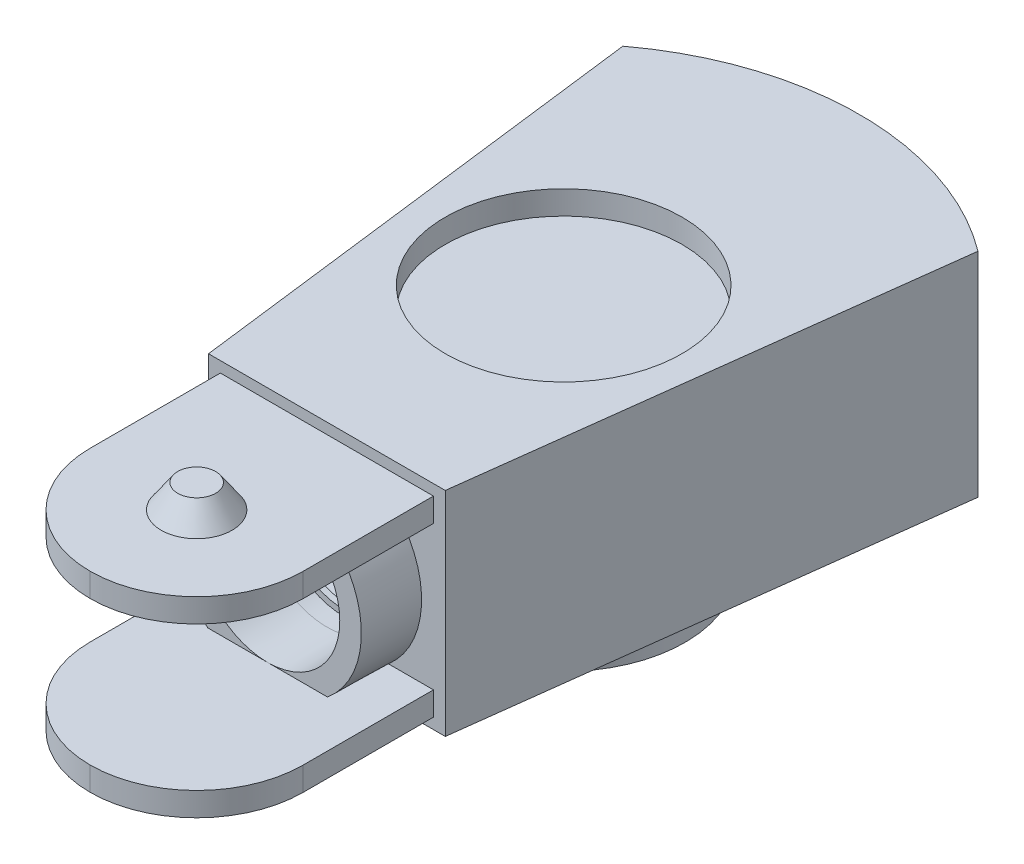
ISO-10303-21;
HEADER;
FILE_DESCRIPTION(('STEP AP214'),'2;1');
FILE_NAME('part.step','',(''),(''),'','','');
FILE_SCHEMA(('AUTOMOTIVE_DESIGN { 1 0 10303 214 1 1 1 1 }'));
ENDSEC;
DATA;
#1=APPLICATION_CONTEXT('core data for automotive mechanical design processes');
#2=APPLICATION_PROTOCOL_DEFINITION('international standard','automotive_design',2000,#1);
#3=PRODUCT_CONTEXT('',#1,'mechanical');
#4=PRODUCT('Part','Part','',(#3));
#5=PRODUCT_RELATED_PRODUCT_CATEGORY('part','',(#4));
#6=PRODUCT_DEFINITION_FORMATION('','',#4);
#7=PRODUCT_DEFINITION_CONTEXT('part definition',#1,'design');
#8=PRODUCT_DEFINITION('design','',#6,#7);
#9=PRODUCT_DEFINITION_SHAPE('','',#8);
#10=(LENGTH_UNIT() NAMED_UNIT(*) SI_UNIT(.MILLI.,.METRE.));
#11=(NAMED_UNIT(*) PLANE_ANGLE_UNIT() SI_UNIT($,.RADIAN.));
#12=(NAMED_UNIT(*) SI_UNIT($,.STERADIAN.) SOLID_ANGLE_UNIT());
#13=UNCERTAINTY_MEASURE_WITH_UNIT(LENGTH_MEASURE(1.E-05),#10,'distance_accuracy_value','');
#14=(GEOMETRIC_REPRESENTATION_CONTEXT(3) GLOBAL_UNCERTAINTY_ASSIGNED_CONTEXT((#13)) GLOBAL_UNIT_ASSIGNED_CONTEXT((#10,
#11,#12)) REPRESENTATION_CONTEXT('',''));
#15=CARTESIAN_POINT('',(0.,0.,0.));
#16=DIRECTION('',(0.,0.,1.));
#17=DIRECTION('',(1.,0.,0.));
#18=AXIS2_PLACEMENT_3D('',#15,#16,#17);
#19=CARTESIAN_POINT('',(0.,9.,5.));
#20=DIRECTION('',(0.,0.,1.));
#21=DIRECTION('',(1.,0.,0.));
#22=AXIS2_PLACEMENT_3D('',#19,#20,#21);
#23=PLANE('',#22);
#24=DIRECTION('',(1.,0.,0.));
#25=VECTOR('',#24,1.);
#26=CARTESIAN_POINT('',(0.,15.0872753246411,5.));
#27=LINE('',#26,#25);
#28=CARTESIAN_POINT('',(-5.05532302727032,15.0872753246411,5.));
#29=VERTEX_POINT('',#28);
#30=CARTESIAN_POINT('',(0.,15.0872753246411,5.00000000000017));
#31=VERTEX_POINT('',#30);
#32=EDGE_CURVE('E358',#29,#31,#27,.T.);
#33=ORIENTED_EDGE('',*,*,#32,.F.);
#34=CARTESIAN_POINT('',(0.,9.,5.));
#35=DIRECTION('',(0.,0.,1.));
#36=DIRECTION('',(1.,0.,0.));
#37=AXIS2_PLACEMENT_3D('',#34,#35,#36);
#38=CIRCLE('',#37,7.91272467535891);
#39=CARTESIAN_POINT('',(-5.05532302727032,2.91272467535891,5.));
#40=VERTEX_POINT('',#39);
#41=EDGE_CURVE('E425',#29,#40,#38,.T.);
#42=ORIENTED_EDGE('',*,*,#41,.T.);
#43=DIRECTION('',(1.,0.,0.));
#44=VECTOR('',#43,1.);
#45=CARTESIAN_POINT('',(0.,2.91272467535891,5.));
#46=LINE('',#45,#44);
#47=CARTESIAN_POINT('',(0.,2.91272467535891,5.));
#48=VERTEX_POINT('',#47);
#49=EDGE_CURVE('E411',#40,#48,#46,.T.);
#50=ORIENTED_EDGE('',*,*,#49,.T.);
#51=CARTESIAN_POINT('',(0.,9.,5.));
#52=DIRECTION('',(0.,0.,1.));
#53=DIRECTION('',(1.,0.,0.));
#54=AXIS2_PLACEMENT_3D('',#51,#52,#53);
#55=CIRCLE('',#54,6.08727532464109);
#56=EDGE_CURVE('E420',#31,#48,#55,.T.);
#57=ORIENTED_EDGE('',*,*,#56,.F.);
#58=EDGE_LOOP('',(#33,#42,#50,#57));
#59=FACE_BOUND('',#58,.T.);
#60=ADVANCED_FACE('F44',(#59),#23,.T.);
#61=CARTESIAN_POINT('',(0.,9.,0.));
#62=DIRECTION('',(0.,0.,-1.));
#63=DIRECTION('',(1.,0.,0.));
#64=AXIS2_PLACEMENT_3D('',#61,#62,#63);
#65=CONICAL_SURFACE('',#64,8.,0.0174532925199433);
#66=ORIENTED_EDGE('',*,*,#41,.F.);
#67=CARTESIAN_POINT('',(-4.583810951182,15.0872753246411,21.7632546142402));
#68=CARTESIAN_POINT('',(-4.65621379185187,15.0872753246411,19.2678319942216));
#69=CARTESIAN_POINT('',(-4.72753868695051,15.0872753246411,16.7723783215212));
#70=CARTESIAN_POINT('',(-4.86827599366824,15.0872753246411,11.7814183800007));
#71=CARTESIAN_POINT('',(-4.93768840633187,15.0872753246411,9.2859121112101));
#72=CARTESIAN_POINT('',(-5.11414042336523,15.0872753246411,2.86487754450447));
#73=CARTESIAN_POINT('',(-5.21994966222969,15.0872753246411,-1.06068452606988));
#74=CARTESIAN_POINT('',(-5.42809839616887,15.0872753246411,-8.91190413269735));
#75=CARTESIAN_POINT('',(-5.53043788825848,15.0872753246411,-12.8375616688297));
#76=CARTESIAN_POINT('',(-5.6313724090243,15.0872753246411,-16.7632546142402));
#77=B_SPLINE_CURVE_WITH_KNOTS('',3,(#67,#68,#69,#70,#71,#72,#73,#74,#75,#76),.UNSPECIFIED.,.F.,
.F.,(4,2,2,2,4),(0.,7.48941770630766,14.9788313220505,26.7597929795082,38.5407647721203),.UNSPECIFIED.);
#78=CARTESIAN_POINT('',(-5.19086496857852,15.0872753246411,0.));
#79=VERTEX_POINT('',#78);
#80=EDGE_CURVE('E351',#29,#79,#77,.T.);
#81=ORIENTED_EDGE('',*,*,#80,.T.);
#82=CARTESIAN_POINT('',(0.,9.,0.));
#83=DIRECTION('',(0.,0.,-1.));
#84=DIRECTION('',(-1.,0.,0.));
#85=AXIS2_PLACEMENT_3D('',#82,#83,#84);
#86=CIRCLE('',#85,8.);
#87=CARTESIAN_POINT('',(-5.19086496857853,2.91272467535891,0.));
#88=VERTEX_POINT('',#87);
#89=EDGE_CURVE('E250',#79,#88,#86,.F.);
#90=ORIENTED_EDGE('',*,*,#89,.T.);
#91=CARTESIAN_POINT('',(-4.58381095118201,2.91272467535891,21.7632546142402));
#92=CARTESIAN_POINT('',(-4.65621379185188,2.91272467535891,19.2678319942216));
#93=CARTESIAN_POINT('',(-4.72753868695051,2.91272467535891,16.7723783215212));
#94=CARTESIAN_POINT('',(-4.86827599366824,2.91272467535891,11.7814183800007));
#95=CARTESIAN_POINT('',(-4.93768840633187,2.91272467535891,9.2859121112101));
#96=CARTESIAN_POINT('',(-5.11414042336524,2.91272467535891,2.86487754450447));
#97=CARTESIAN_POINT('',(-5.2199496622297,2.91272467535891,-1.06068452606988));
#98=CARTESIAN_POINT('',(-5.42809839616887,2.91272467535891,-8.91190413269735));
#99=CARTESIAN_POINT('',(-5.53043788825848,2.91272467535891,-12.8375616688297));
#100=CARTESIAN_POINT('',(-5.63137240902431,2.91272467535891,-16.7632546142402));
#101=B_SPLINE_CURVE_WITH_KNOTS('',3,(#91,#92,#93,#94,#95,#96,#97,#98,#99,#100),.UNSPECIFIED.,
.F.,.F.,(4,2,2,2,4),(0.,7.48941770630766,14.9788313220505,26.7597929795082,38.5407647721203),.UNSPECIFIED.);
#102=EDGE_CURVE('E403',#40,#88,#101,.T.);
#103=ORIENTED_EDGE('',*,*,#102,.F.);
#104=EDGE_LOOP('',(#66,#81,#90,#103));
#105=FACE_BOUND('',#104,.T.);
#106=ADVANCED_FACE('F497',(#105),#65,.T.);
#107=CARTESIAN_POINT('',(-10.,2.,0.));
#108=DIRECTION('',(0.,0.,-1.));
#109=DIRECTION('',(-1.,0.,0.));
#110=AXIS2_PLACEMENT_3D('',#107,#108,#109);
#111=PLANE('',#110);
#112=DIRECTION('',(1.,0.,0.));
#113=VECTOR('',#112,1.);
#114=CARTESIAN_POINT('',(-10.,0.,0.));
#115=LINE('',#114,#113);
#116=CARTESIAN_POINT('',(-10.,0.,0.));
#117=VERTEX_POINT('',#116);
#118=CARTESIAN_POINT('',(10.,0.,0.));
#119=VERTEX_POINT('',#118);
#120=EDGE_CURVE('E226',#117,#119,#115,.T.);
#121=ORIENTED_EDGE('',*,*,#120,.T.);
#122=DIRECTION('',(0.,-1.,0.));
#123=VECTOR('',#122,1.);
#124=CARTESIAN_POINT('',(10.,2.,0.));
#125=LINE('',#124,#123);
#126=CARTESIAN_POINT('',(10.,18.,0.));
#127=VERTEX_POINT('',#126);
#128=EDGE_CURVE('E244',#127,#119,#125,.T.);
#129=ORIENTED_EDGE('',*,*,#128,.F.);
#130=DIRECTION('',(1.,0.,0.));
#131=VECTOR('',#130,1.);
#132=CARTESIAN_POINT('',(-10.,18.,0.));
#133=LINE('',#132,#131);
#134=CARTESIAN_POINT('',(-10.,18.,0.));
#135=VERTEX_POINT('',#134);
#136=EDGE_CURVE('E424',#135,#127,#133,.T.);
#137=ORIENTED_EDGE('',*,*,#136,.F.);
#138=DIRECTION('',(0.,-1.,0.));
#139=VECTOR('',#138,1.);
#140=CARTESIAN_POINT('',(-10.,2.,0.));
#141=LINE('',#140,#139);
#142=EDGE_CURVE('E247',#135,#117,#141,.T.);
#143=ORIENTED_EDGE('',*,*,#142,.T.);
#144=EDGE_LOOP('',(#121,#129,#137,#143));
#145=FACE_BOUND('',#144,.T.);
#146=DIRECTION('',(0.,-1.,0.));
#147=VECTOR('',#146,1.);
#148=CARTESIAN_POINT('',(9.,17.0872753246411,0.));
#149=LINE('',#148,#147);
#150=CARTESIAN_POINT('',(9.,17.0872753246411,0.));
#151=VERTEX_POINT('',#150);
#152=CARTESIAN_POINT('',(9.,15.0872753246411,0.));
#153=VERTEX_POINT('',#152);
#154=EDGE_CURVE('E290',#151,#153,#149,.T.);
#155=ORIENTED_EDGE('',*,*,#154,.T.);
#156=DIRECTION('',(-1.,0.,0.));
#157=VECTOR('',#156,1.);
#158=CARTESIAN_POINT('',(9.,15.0872753246411,0.));
#159=LINE('',#158,#157);
#160=CARTESIAN_POINT('',(5.19086496857852,15.0872753246411,0.));
#161=VERTEX_POINT('',#160);
#162=EDGE_CURVE('E313',#153,#161,#159,.T.);
#163=ORIENTED_EDGE('',*,*,#162,.T.);
#164=CARTESIAN_POINT('',(5.19086496857853,2.91272467535891,0.));
#165=VERTEX_POINT('',#164);
#166=EDGE_CURVE('E251',#165,#161,#86,.F.);
#167=ORIENTED_EDGE('',*,*,#166,.F.);
#168=DIRECTION('',(-1.,0.,0.));
#169=VECTOR('',#168,1.);
#170=CARTESIAN_POINT('',(9.,2.91272467535891,0.));
#171=LINE('',#170,#169);
#172=CARTESIAN_POINT('',(9.,2.91272467535891,0.));
#173=VERTEX_POINT('',#172);
#174=EDGE_CURVE('E364',#173,#165,#171,.T.);
#175=ORIENTED_EDGE('',*,*,#174,.F.);
#176=DIRECTION('',(0.,1.,0.));
#177=VECTOR('',#176,1.);
#178=CARTESIAN_POINT('',(9.,0.912724675358912,0.));
#179=LINE('',#178,#177);
#180=CARTESIAN_POINT('',(9.,0.912724675358912,0.));
#181=VERTEX_POINT('',#180);
#182=EDGE_CURVE('E274',#181,#173,#179,.T.);
#183=ORIENTED_EDGE('',*,*,#182,.F.);
#184=DIRECTION('',(1.,0.,0.));
#185=VECTOR('',#184,1.);
#186=CARTESIAN_POINT('',(-9.,0.912724675358912,0.));
#187=LINE('',#186,#185);
#188=CARTESIAN_POINT('',(-9.,0.912724675358912,0.));
#189=VERTEX_POINT('',#188);
#190=EDGE_CURVE('E370',#189,#181,#187,.T.);
#191=ORIENTED_EDGE('',*,*,#190,.F.);
#192=DIRECTION('',(0.,-1.,0.));
#193=VECTOR('',#192,1.);
#194=CARTESIAN_POINT('',(-9.,2.91272467535891,0.));
#195=LINE('',#194,#193);
#196=CARTESIAN_POINT('',(-9.,2.91272467535891,0.));
#197=VERTEX_POINT('',#196);
#198=EDGE_CURVE('E367',#197,#189,#195,.T.);
#199=ORIENTED_EDGE('',*,*,#198,.F.);
#200=EDGE_CURVE('E363',#88,#197,#171,.T.);
#201=ORIENTED_EDGE('',*,*,#200,.F.);
#202=ORIENTED_EDGE('',*,*,#89,.F.);
#203=CARTESIAN_POINT('',(-9.,15.0872753246411,0.));
#204=VERTEX_POINT('',#203);
#205=EDGE_CURVE('E312',#79,#204,#159,.T.);
#206=ORIENTED_EDGE('',*,*,#205,.T.);
#207=DIRECTION('',(0.,1.,0.));
#208=VECTOR('',#207,1.);
#209=CARTESIAN_POINT('',(-9.,15.0872753246411,0.));
#210=LINE('',#209,#208);
#211=CARTESIAN_POINT('',(-9.,17.0872753246411,0.));
#212=VERTEX_POINT('',#211);
#213=EDGE_CURVE('E309',#204,#212,#210,.T.);
#214=ORIENTED_EDGE('',*,*,#213,.T.);
#215=DIRECTION('',(1.,0.,0.));
#216=VECTOR('',#215,1.);
#217=CARTESIAN_POINT('',(-9.,17.0872753246411,0.));
#218=LINE('',#217,#216);
#219=EDGE_CURVE('E295',#212,#151,#218,.T.);
#220=ORIENTED_EDGE('',*,*,#219,.T.);
#221=EDGE_LOOP('',(#155,#163,#167,#175,#183,#191,#199,#201,#202,#206,#214,#220));
#222=FACE_BOUND('',#221,.T.);
#223=ADVANCED_FACE('F504',(#145,#222),#111,.F.);
#224=CARTESIAN_POINT('',(5.05532302727032,15.0872753246411,5.));
#225=VERTEX_POINT('',#224);
#226=EDGE_CURVE('E333',#31,#225,#27,.T.);
#227=ORIENTED_EDGE('',*,*,#226,.F.);
#228=EDGE_CURVE('E426',#48,#31,#55,.T.);
#229=ORIENTED_EDGE('',*,*,#228,.F.);
#230=CARTESIAN_POINT('',(5.05532302727032,2.91272467535891,5.));
#231=VERTEX_POINT('',#230);
#232=EDGE_CURVE('E389',#48,#231,#46,.T.);
#233=ORIENTED_EDGE('',*,*,#232,.T.);
#234=EDGE_CURVE('E421',#231,#225,#38,.T.);
#235=ORIENTED_EDGE('',*,*,#234,.T.);
#236=EDGE_LOOP('',(#227,#229,#233,#235));
#237=FACE_BOUND('',#236,.T.);
#238=ADVANCED_FACE('F499',(#237),#23,.T.);
#239=ORIENTED_EDGE('',*,*,#166,.T.);
#240=CARTESIAN_POINT('',(5.6313724090243,15.0872753246411,-16.7632546142402));
#241=CARTESIAN_POINT('',(5.56156002467126,15.0872753246411,-14.0473636682685));
#242=CARTESIAN_POINT('',(5.49105647981778,15.0872753246411,-11.3314904446937));
#243=CARTESIAN_POINT('',(5.34847851531824,15.0872753246411,-5.89978674369881));
#244=CARTESIAN_POINT('',(5.27640409653559,15.0872753246411,-3.18395626625615));
#245=CARTESIAN_POINT('',(5.10391424818704,15.0872753246411,3.23718621786052));
#246=CARTESIAN_POINT('',(5.00274093355046,15.0872753246411,6.94247795313005));
#247=CARTESIAN_POINT('',(4.79642569696807,15.0872753246411,14.3529536002264));
#248=CARTESIAN_POINT('',(4.69128377203576,15.0872753246411,18.05813751197));
#249=CARTESIAN_POINT('',(4.583810951182,15.0872753246411,21.7632546142402));
#250=B_SPLINE_CURVE_WITH_KNOTS('',3,(#240,#241,#242,#243,#244,#245,#246,#247,#248,#249),
.UNSPECIFIED.,.F.,.F.,(4,2,2,2,4),(0.,8.15036414026122,16.3007238008843,27.4207400212957,
38.5407646100221),.UNSPECIFIED.);
#251=EDGE_CURVE('E324',#161,#225,#250,.T.);
#252=ORIENTED_EDGE('',*,*,#251,.T.);
#253=ORIENTED_EDGE('',*,*,#234,.F.);
#254=CARTESIAN_POINT('',(5.63137240902431,2.91272467535891,-16.7632546142402));
#255=CARTESIAN_POINT('',(5.56156002467127,2.91272467535891,-14.0473636682685));
#256=CARTESIAN_POINT('',(5.49105647981779,2.91272467535891,-11.3314904446937));
#257=CARTESIAN_POINT('',(5.34847851531824,2.91272467535891,-5.89978674369881));
#258=CARTESIAN_POINT('',(5.27640409653559,2.91272467535891,-3.18395626625615));
#259=CARTESIAN_POINT('',(5.10391424818704,2.91272467535891,3.23718621786052));
#260=CARTESIAN_POINT('',(5.00274093355046,2.91272467535891,6.94247795313005));
#261=CARTESIAN_POINT('',(4.79642569696807,2.91272467535891,14.3529536002264));
#262=CARTESIAN_POINT('',(4.69128377203576,2.91272467535891,18.05813751197));
#263=CARTESIAN_POINT('',(4.58381095118201,2.91272467535891,21.7632546142402));
#264=B_SPLINE_CURVE_WITH_KNOTS('',3,(#254,#255,#256,#257,#258,#259,#260,#261,#262,#263),
.UNSPECIFIED.,.F.,.F.,(4,2,2,2,4),(0.,8.15036414026122,16.3007238008843,27.4207400212957,
38.5407646100221),.UNSPECIFIED.);
#265=EDGE_CURVE('E381',#165,#231,#264,.T.);
#266=ORIENTED_EDGE('',*,*,#265,.F.);
#267=EDGE_LOOP('',(#239,#252,#253,#266));
#268=FACE_BOUND('',#267,.T.);
#269=ADVANCED_FACE('F335',(#268),#65,.T.);
#270=CARTESIAN_POINT('',(0.,9.,-2.));
#271=DIRECTION('',(0.,0.,1.));
#272=DIRECTION('',(1.,0.,0.));
#273=AXIS2_PLACEMENT_3D('',#270,#271,#272);
#274=CYLINDRICAL_SURFACE('',#273,6.);
#275=CARTESIAN_POINT('',(0.,9.,0.));
#276=DIRECTION('',(0.,0.,1.));
#277=DIRECTION('',(1.,0.,0.));
#278=AXIS2_PLACEMENT_3D('',#275,#276,#277);
#279=CIRCLE('',#278,6.);
#280=CARTESIAN_POINT('',(6.,9.,0.));
#281=VERTEX_POINT('',#280);
#282=EDGE_CURVE('E415',#281,#281,#279,.T.);
#283=ORIENTED_EDGE('',*,*,#282,.T.);
#284=EDGE_LOOP('',(#283));
#285=FACE_BOUND('',#284,.T.);
#286=CARTESIAN_POINT('',(0.,9.,-1.5));
#287=DIRECTION('',(0.,0.,-1.));
#288=DIRECTION('',(-1.,0.,0.));
#289=AXIS2_PLACEMENT_3D('',#286,#287,#288);
#290=CIRCLE('',#289,6.);
#291=CARTESIAN_POINT('',(-6.,9.,-1.5));
#292=VERTEX_POINT('',#291);
#293=EDGE_CURVE('E254',#292,#292,#290,.F.);
#294=ORIENTED_EDGE('',*,*,#293,.F.);
#295=EDGE_LOOP('',(#294));
#296=FACE_BOUND('',#295,.T.);
#297=ADVANCED_FACE('F514',(#285,#296),#274,.F.);
#298=CARTESIAN_POINT('',(-10.,2.,0.));
#299=DIRECTION('',(0.992277876713668,0.,-0.124034734589208));
#300=DIRECTION('',(-0.124034734589208,0.,-0.992277876713668));
#301=AXIS2_PLACEMENT_3D('',#298,#299,#300);
#302=PLANE('',#301);
#303=DIRECTION('',(0.124034734589208,0.,0.992277876713668));
#304=VECTOR('',#303,1.);
#305=CARTESIAN_POINT('',(-10.,0.,0.));
#306=LINE('',#305,#304);
#307=CARTESIAN_POINT('',(-15.,0.,-40.));
#308=VERTEX_POINT('',#307);
#309=EDGE_CURVE('E223',#308,#117,#306,.T.);
#310=ORIENTED_EDGE('',*,*,#309,.T.);
#311=ORIENTED_EDGE('',*,*,#142,.F.);
#312=DIRECTION('',(0.124034734589208,0.,0.992277876713668));
#313=VECTOR('',#312,1.);
#314=CARTESIAN_POINT('',(-15.,18.,-40.));
#315=LINE('',#314,#313);
#316=CARTESIAN_POINT('',(-15.,18.,-40.));
#317=VERTEX_POINT('',#316);
#318=EDGE_CURVE('E437',#317,#135,#315,.T.);
#319=ORIENTED_EDGE('',*,*,#318,.F.);
#320=DIRECTION('',(0.,-1.,0.));
#321=VECTOR('',#320,1.);
#322=CARTESIAN_POINT('',(-15.,2.,-40.));
#323=LINE('',#322,#321);
#324=EDGE_CURVE('E232',#317,#308,#323,.T.);
#325=ORIENTED_EDGE('',*,*,#324,.T.);
#326=EDGE_LOOP('',(#310,#311,#319,#325));
#327=FACE_BOUND('',#326,.T.);
#328=ADVANCED_FACE('F536',(#327),#302,.F.);
#329=CARTESIAN_POINT('',(10.,2.,0.));
#330=DIRECTION('',(-0.992277876713668,0.,-0.124034734589208));
#331=DIRECTION('',(-0.124034734589208,0.,0.992277876713668));
#332=AXIS2_PLACEMENT_3D('',#329,#330,#331);
#333=PLANE('',#332);
#334=DIRECTION('',(0.124034734589208,0.,-0.992277876713668));
#335=VECTOR('',#334,1.);
#336=CARTESIAN_POINT('',(10.,0.,0.));
#337=LINE('',#336,#335);
#338=CARTESIAN_POINT('',(15.,0.,-40.));
#339=VERTEX_POINT('',#338);
#340=EDGE_CURVE('E236',#119,#339,#337,.T.);
#341=ORIENTED_EDGE('',*,*,#340,.T.);
#342=DIRECTION('',(0.,-1.,0.));
#343=VECTOR('',#342,1.);
#344=CARTESIAN_POINT('',(15.,2.,-40.));
#345=LINE('',#344,#343);
#346=CARTESIAN_POINT('',(15.,18.,-40.));
#347=VERTEX_POINT('',#346);
#348=EDGE_CURVE('E241',#347,#339,#345,.T.);
#349=ORIENTED_EDGE('',*,*,#348,.F.);
#350=DIRECTION('',(0.124034734589208,0.,-0.992277876713668));
#351=VECTOR('',#350,1.);
#352=CARTESIAN_POINT('',(10.,18.,0.));
#353=LINE('',#352,#351);
#354=EDGE_CURVE('E431',#127,#347,#353,.T.);
#355=ORIENTED_EDGE('',*,*,#354,.F.);
#356=ORIENTED_EDGE('',*,*,#128,.T.);
#357=EDGE_LOOP('',(#341,#349,#355,#356));
#358=FACE_BOUND('',#357,.T.);
#359=ADVANCED_FACE('F564',(#358),#333,.F.);
#360=CARTESIAN_POINT('',(0.,2.,-20.));
#361=DIRECTION('',(0.,-1.,0.));
#362=DIRECTION('',(0.,0.,-1.));
#363=AXIS2_PLACEMENT_3D('',#360,#361,#362);
#364=CYLINDRICAL_SURFACE('',#363,25.);
#365=DIRECTION('',(0.,-1.,0.));
#366=VECTOR('',#365,1.);
#367=CARTESIAN_POINT('',(13.1427593877155,16.,-41.2665905983215));
#368=LINE('',#367,#366);
#369=CARTESIAN_POINT('',(13.1427593877155,15.,-41.2665905983215));
#370=VERTEX_POINT('',#369);
#371=CARTESIAN_POINT('',(13.1427593877155,2.,-41.2665905983215));
#372=VERTEX_POINT('',#371);
#373=EDGE_CURVE('E213',#370,#372,#368,.T.);
#374=ORIENTED_EDGE('',*,*,#373,.F.);
#375=CARTESIAN_POINT('',(0.,15.,-20.));
#376=DIRECTION('',(0.,-1.,0.));
#377=DIRECTION('',(0.,0.,-1.));
#378=AXIS2_PLACEMENT_3D('',#375,#376,#377);
#379=CIRCLE('',#378,25.);
#380=CARTESIAN_POINT('',(-13.1427593877155,15.,-41.2665905983215));
#381=VERTEX_POINT('',#380);
#382=EDGE_CURVE('E198',#381,#370,#379,.T.);
#383=ORIENTED_EDGE('',*,*,#382,.F.);
#384=DIRECTION('',(0.,-1.,0.));
#385=VECTOR('',#384,1.);
#386=CARTESIAN_POINT('',(-13.1427593877155,16.,-41.2665905983215));
#387=LINE('',#386,#385);
#388=CARTESIAN_POINT('',(-13.1427593877155,2.,-41.2665905983215));
#389=VERTEX_POINT('',#388);
#390=EDGE_CURVE('E448',#381,#389,#387,.T.);
#391=ORIENTED_EDGE('',*,*,#390,.T.);
#392=CARTESIAN_POINT('',(0.,2.,-20.));
#393=DIRECTION('',(0.,1.,0.));
#394=DIRECTION('',(0.,0.,1.));
#395=AXIS2_PLACEMENT_3D('',#392,#393,#394);
#396=CIRCLE('',#395,25.);
#397=EDGE_CURVE('E222',#372,#389,#396,.T.);
#398=ORIENTED_EDGE('',*,*,#397,.F.);
#399=EDGE_LOOP('',(#374,#383,#391,#398));
#400=FACE_BOUND('',#399,.T.);
#401=ORIENTED_EDGE('',*,*,#324,.F.);
#402=CARTESIAN_POINT('',(0.,18.,-20.));
#403=DIRECTION('',(0.,1.,0.));
#404=DIRECTION('',(0.,0.,1.));
#405=AXIS2_PLACEMENT_3D('',#402,#403,#404);
#406=CIRCLE('',#405,25.);
#407=EDGE_CURVE('E434',#347,#317,#406,.T.);
#408=ORIENTED_EDGE('',*,*,#407,.F.);
#409=ORIENTED_EDGE('',*,*,#348,.T.);
#410=CARTESIAN_POINT('',(0.,0.,-20.));
#411=DIRECTION('',(0.,1.,0.));
#412=DIRECTION('',(0.,0.,1.));
#413=AXIS2_PLACEMENT_3D('',#410,#411,#412);
#414=CIRCLE('',#413,25.);
#415=EDGE_CURVE('E233',#339,#308,#414,.T.);
#416=ORIENTED_EDGE('',*,*,#415,.T.);
#417=EDGE_LOOP('',(#401,#408,#409,#416));
#418=FACE_BOUND('',#417,.T.);
#419=ADVANCED_FACE('F219',(#400,#418),#364,.T.);
#420=CARTESIAN_POINT('',(0.,2.,-20.));
#421=DIRECTION('',(0.,1.,0.));
#422=DIRECTION('',(0.,0.,1.));
#423=AXIS2_PLACEMENT_3D('',#420,#421,#422);
#424=PLANE('',#423);
#425=DIRECTION('',(-0.124034734589208,0.,-0.992277876713668));
#426=VECTOR('',#425,1.);
#427=CARTESIAN_POINT('',(-13.1427593877155,2.,-41.2665905983215));
#428=LINE('',#427,#426);
#429=CARTESIAN_POINT('',(-8.23443556292536,2.,-2.));
#430=VERTEX_POINT('',#429);
#431=EDGE_CURVE('E445',#430,#389,#428,.T.);
#432=ORIENTED_EDGE('',*,*,#431,.F.);
#433=DIRECTION('',(-1.,0.,0.));
#434=VECTOR('',#433,1.);
#435=CARTESIAN_POINT('',(-8.23443556292536,2.,-2.));
#436=LINE('',#435,#434);
#437=CARTESIAN_POINT('',(8.23443556292536,2.,-2.));
#438=VERTEX_POINT('',#437);
#439=EDGE_CURVE('E442',#438,#430,#436,.T.);
#440=ORIENTED_EDGE('',*,*,#439,.F.);
#441=DIRECTION('',(-0.124034734589208,0.,0.992277876713668));
#442=VECTOR('',#441,1.);
#443=CARTESIAN_POINT('',(8.23443556292536,2.,-2.));
#444=LINE('',#443,#442);
#445=EDGE_CURVE('E440',#372,#438,#444,.T.);
#446=ORIENTED_EDGE('',*,*,#445,.F.);
#447=ORIENTED_EDGE('',*,*,#397,.T.);
#448=EDGE_LOOP('',(#432,#440,#446,#447));
#449=FACE_BOUND('',#448,.T.);
#450=ADVANCED_FACE('F456',(#449),#424,.T.);
#451=CARTESIAN_POINT('',(0.,0.,-20.));
#452=DIRECTION('',(0.,1.,0.));
#453=DIRECTION('',(0.,0.,1.));
#454=AXIS2_PLACEMENT_3D('',#451,#452,#453);
#455=PLANE('',#454);
#456=CARTESIAN_POINT('',(0.,0.,-20.));
#457=DIRECTION('',(0.,1.,0.));
#458=DIRECTION('',(0.,0.,1.));
#459=AXIS2_PLACEMENT_3D('',#456,#457,#458);
#460=CIRCLE('',#459,10.25);
#461=CARTESIAN_POINT('',(0.,0.,-9.75));
#462=VERTEX_POINT('',#461);
#463=EDGE_CURVE('E303',#462,#462,#460,.T.);
#464=ORIENTED_EDGE('',*,*,#463,.T.);
#465=EDGE_LOOP('',(#464));
#466=FACE_BOUND('',#465,.T.);
#467=ORIENTED_EDGE('',*,*,#309,.F.);
#468=ORIENTED_EDGE('',*,*,#415,.F.);
#469=ORIENTED_EDGE('',*,*,#340,.F.);
#470=ORIENTED_EDGE('',*,*,#120,.F.);
#471=EDGE_LOOP('',(#467,#468,#469,#470));
#472=FACE_BOUND('',#471,.T.);
#473=ADVANCED_FACE('F478',(#466,#472),#455,.F.);
#474=CARTESIAN_POINT('',(8.23443556292536,16.,-2.));
#475=DIRECTION('',(0.992277876713668,0.,0.124034734589208));
#476=DIRECTION('',(0.124034734589208,0.,-0.992277876713668));
#477=AXIS2_PLACEMENT_3D('',#474,#475,#476);
#478=PLANE('',#477);
#479=DIRECTION('',(0.,-1.,0.));
#480=VECTOR('',#479,1.);
#481=CARTESIAN_POINT('',(8.23443556292536,16.,-2.));
#482=LINE('',#481,#480);
#483=CARTESIAN_POINT('',(8.23443556292536,15.,-2.));
#484=VERTEX_POINT('',#483);
#485=EDGE_CURVE('E215',#484,#438,#482,.T.);
#486=ORIENTED_EDGE('',*,*,#485,.F.);
#487=DIRECTION('',(-0.124034734589208,0.,0.992277876713668));
#488=VECTOR('',#487,1.);
#489=CARTESIAN_POINT('',(13.1427593877155,15.,-41.2665905983215));
#490=LINE('',#489,#488);
#491=EDGE_CURVE('E201',#370,#484,#490,.T.);
#492=ORIENTED_EDGE('',*,*,#491,.F.);
#493=ORIENTED_EDGE('',*,*,#373,.T.);
#494=ORIENTED_EDGE('',*,*,#445,.T.);
#495=EDGE_LOOP('',(#486,#492,#493,#494));
#496=FACE_BOUND('',#495,.T.);
#497=ADVANCED_FACE('F211',(#496),#478,.F.);
#498=CARTESIAN_POINT('',(-8.23443556292536,16.,-2.));
#499=DIRECTION('',(0.,0.,1.));
#500=DIRECTION('',(1.,0.,0.));
#501=AXIS2_PLACEMENT_3D('',#498,#499,#500);
#502=PLANE('',#501);
#503=DIRECTION('',(0.,-1.,0.));
#504=VECTOR('',#503,1.);
#505=CARTESIAN_POINT('',(-8.23443556292536,16.,-2.));
#506=LINE('',#505,#504);
#507=CARTESIAN_POINT('',(-8.23443556292536,15.,-2.));
#508=VERTEX_POINT('',#507);
#509=EDGE_CURVE('E228',#508,#430,#506,.T.);
#510=ORIENTED_EDGE('',*,*,#509,.F.);
#511=DIRECTION('',(-1.,0.,0.));
#512=VECTOR('',#511,1.);
#513=CARTESIAN_POINT('',(8.23443556292536,15.,-2.));
#514=LINE('',#513,#512);
#515=EDGE_CURVE('E216',#484,#508,#514,.T.);
#516=ORIENTED_EDGE('',*,*,#515,.F.);
#517=ORIENTED_EDGE('',*,*,#485,.T.);
#518=ORIENTED_EDGE('',*,*,#439,.T.);
#519=EDGE_LOOP('',(#510,#516,#517,#518));
#520=FACE_BOUND('',#519,.T.);
#521=CARTESIAN_POINT('',(0.,9.,-2.));
#522=DIRECTION('',(0.,0.,-1.));
#523=DIRECTION('',(-1.,0.,0.));
#524=AXIS2_PLACEMENT_3D('',#521,#522,#523);
#525=CIRCLE('',#524,5.5);
#526=CARTESIAN_POINT('',(-5.5,9.,-2.));
#527=VERTEX_POINT('',#526);
#528=EDGE_CURVE('E410',#527,#527,#525,.T.);
#529=ORIENTED_EDGE('',*,*,#528,.F.);
#530=EDGE_LOOP('',(#529));
#531=FACE_BOUND('',#530,.T.);
#532=ADVANCED_FACE('F457',(#520,#531),#502,.F.);
#533=CARTESIAN_POINT('',(-13.1427593877155,16.,-41.2665905983215));
#534=DIRECTION('',(-0.992277876713668,0.,0.124034734589208));
#535=DIRECTION('',(0.124034734589208,0.,0.992277876713668));
#536=AXIS2_PLACEMENT_3D('',#533,#534,#535);
#537=PLANE('',#536);
#538=ORIENTED_EDGE('',*,*,#390,.F.);
#539=DIRECTION('',(-0.124034734589208,0.,-0.992277876713668));
#540=VECTOR('',#539,1.);
#541=CARTESIAN_POINT('',(-8.23443556292536,15.,-2.));
#542=LINE('',#541,#540);
#543=EDGE_CURVE('E204',#508,#381,#542,.T.);
#544=ORIENTED_EDGE('',*,*,#543,.F.);
#545=ORIENTED_EDGE('',*,*,#509,.T.);
#546=ORIENTED_EDGE('',*,*,#431,.T.);
#547=EDGE_LOOP('',(#538,#544,#545,#546));
#548=FACE_BOUND('',#547,.T.);
#549=ADVANCED_FACE('F452',(#548),#537,.F.);
#550=CARTESIAN_POINT('',(0.,18.,-20.));
#551=DIRECTION('',(0.,1.,0.));
#552=DIRECTION('',(0.,0.,1.));
#553=AXIS2_PLACEMENT_3D('',#550,#551,#552);
#554=PLANE('',#553);
#555=CARTESIAN_POINT('',(0.,18.,-20.));
#556=DIRECTION('',(0.,1.,0.));
#557=DIRECTION('',(0.,0.,1.));
#558=AXIS2_PLACEMENT_3D('',#555,#556,#557);
#559=CIRCLE('',#558,10.);
#560=CARTESIAN_POINT('',(0.,18.,-10.));
#561=VERTEX_POINT('',#560);
#562=EDGE_CURVE('E465',#561,#561,#559,.T.);
#563=ORIENTED_EDGE('',*,*,#562,.F.);
#564=EDGE_LOOP('',(#563));
#565=FACE_BOUND('',#564,.T.);
#566=ORIENTED_EDGE('',*,*,#136,.T.);
#567=ORIENTED_EDGE('',*,*,#354,.T.);
#568=ORIENTED_EDGE('',*,*,#407,.T.);
#569=ORIENTED_EDGE('',*,*,#318,.T.);
#570=EDGE_LOOP('',(#566,#567,#568,#569));
#571=FACE_BOUND('',#570,.T.);
#572=ADVANCED_FACE('F531',(#565,#571),#554,.T.);
#573=CARTESIAN_POINT('',(0.,9.,0.));
#574=DIRECTION('',(0.,0.,1.));
#575=DIRECTION('',(1.,0.,0.));
#576=AXIS2_PLACEMENT_3D('',#573,#574,#575);
#577=CONICAL_SURFACE('',#576,6.,0.0174532925199433);
#578=ORIENTED_EDGE('',*,*,#228,.T.);
#579=ORIENTED_EDGE('',*,*,#56,.T.);
#580=EDGE_LOOP('',(#578,#579));
#581=FACE_BOUND('',#580,.T.);
#582=ORIENTED_EDGE('',*,*,#282,.F.);
#583=EDGE_LOOP('',(#582));
#584=FACE_BOUND('',#583,.T.);
#585=ADVANCED_FACE('F527',(#581,#584),#577,.F.);
#586=CARTESIAN_POINT('',(0.,9.,-1.5));
#587=DIRECTION('',(0.,0.,-1.));
#588=DIRECTION('',(-1.,0.,0.));
#589=AXIS2_PLACEMENT_3D('',#586,#587,#588);
#590=PLANE('',#589);
#591=CARTESIAN_POINT('',(0.,9.,-1.5));
#592=DIRECTION('',(0.,0.,-1.));
#593=DIRECTION('',(-1.,0.,0.));
#594=AXIS2_PLACEMENT_3D('',#591,#592,#593);
#595=CIRCLE('',#594,5.5);
#596=CARTESIAN_POINT('',(-5.5,9.,-1.5));
#597=VERTEX_POINT('',#596);
#598=EDGE_CURVE('E412',#597,#597,#595,.T.);
#599=ORIENTED_EDGE('',*,*,#598,.T.);
#600=EDGE_LOOP('',(#599));
#601=FACE_BOUND('',#600,.T.);
#602=ORIENTED_EDGE('',*,*,#293,.T.);
#603=EDGE_LOOP('',(#602));
#604=FACE_BOUND('',#603,.T.);
#605=ADVANCED_FACE('F530',(#601,#604),#590,.F.);
#606=CARTESIAN_POINT('',(0.,9.,-1.5));
#607=DIRECTION('',(0.,0.,-1.));
#608=DIRECTION('',(-1.,0.,0.));
#609=AXIS2_PLACEMENT_3D('',#606,#607,#608);
#610=CYLINDRICAL_SURFACE('',#609,5.5);
#611=ORIENTED_EDGE('',*,*,#598,.F.);
#612=EDGE_LOOP('',(#611));
#613=FACE_BOUND('',#612,.T.);
#614=ORIENTED_EDGE('',*,*,#528,.T.);
#615=EDGE_LOOP('',(#614));
#616=FACE_BOUND('',#615,.T.);
#617=ADVANCED_FACE('F397',(#613,#616),#610,.F.);
#618=CARTESIAN_POINT('',(9.,2.91272467535891,20.));
#619=DIRECTION('',(0.,-1.,0.));
#620=DIRECTION('',(0.,0.,-1.));
#621=AXIS2_PLACEMENT_3D('',#618,#619,#620);
#622=PLANE('',#621);
#623=DIRECTION('',(0.,0.,-1.));
#624=VECTOR('',#623,1.);
#625=CARTESIAN_POINT('',(-9.,2.91272467535891,20.));
#626=LINE('',#625,#624);
#627=CARTESIAN_POINT('',(-9.,2.91272467535891,11.));
#628=VERTEX_POINT('',#627);
#629=EDGE_CURVE('E377',#628,#197,#626,.T.);
#630=ORIENTED_EDGE('',*,*,#629,.F.);
#631=CARTESIAN_POINT('',(0.,2.91272467535891,11.));
#632=DIRECTION('',(0.,-1.,0.));
#633=DIRECTION('',(0.,0.,-1.));
#634=AXIS2_PLACEMENT_3D('',#631,#632,#633);
#635=CIRCLE('',#634,9.);
#636=CARTESIAN_POINT('',(0.,2.91272467535891,20.));
#637=VERTEX_POINT('',#636);
#638=EDGE_CURVE('E266',#628,#637,#635,.F.);
#639=ORIENTED_EDGE('',*,*,#638,.T.);
#640=CARTESIAN_POINT('',(0.,2.91272467535891,11.));
#641=DIRECTION('',(0.,-1.,0.));
#642=DIRECTION('',(0.,0.,-1.));
#643=AXIS2_PLACEMENT_3D('',#640,#641,#642);
#644=CIRCLE('',#643,9.);
#645=CARTESIAN_POINT('',(9.,2.91272467535891,11.));
#646=VERTEX_POINT('',#645);
#647=EDGE_CURVE('E264',#637,#646,#644,.F.);
#648=ORIENTED_EDGE('',*,*,#647,.T.);
#649=DIRECTION('',(0.,0.,-1.));
#650=VECTOR('',#649,1.);
#651=CARTESIAN_POINT('',(9.,2.91272467535891,20.));
#652=LINE('',#651,#650);
#653=EDGE_CURVE('E379',#646,#173,#652,.T.);
#654=ORIENTED_EDGE('',*,*,#653,.T.);
#655=ORIENTED_EDGE('',*,*,#174,.T.);
#656=ORIENTED_EDGE('',*,*,#265,.T.);
#657=ORIENTED_EDGE('',*,*,#232,.F.);
#658=ORIENTED_EDGE('',*,*,#49,.F.);
#659=ORIENTED_EDGE('',*,*,#102,.T.);
#660=ORIENTED_EDGE('',*,*,#200,.T.);
#661=EDGE_LOOP('',(#630,#639,#648,#654,#655,#656,#657,#658,#659,#660));
#662=FACE_BOUND('',#661,.T.);
#663=ADVANCED_FACE('F391',(#662),#622,.F.);
#664=CARTESIAN_POINT('',(9.,0.912724675358912,20.));
#665=DIRECTION('',(-1.,0.,0.));
#666=DIRECTION('',(0.,0.,1.));
#667=AXIS2_PLACEMENT_3D('',#664,#665,#666);
#668=PLANE('',#667);
#669=ORIENTED_EDGE('',*,*,#653,.F.);
#670=DIRECTION('',(0.,1.,0.));
#671=VECTOR('',#670,1.);
#672=CARTESIAN_POINT('',(9.,0.912724675358912,11.));
#673=LINE('',#672,#671);
#674=CARTESIAN_POINT('',(9.,0.912724675358912,11.));
#675=VERTEX_POINT('',#674);
#676=EDGE_CURVE('E268',#646,#675,#673,.F.);
#677=ORIENTED_EDGE('',*,*,#676,.T.);
#678=DIRECTION('',(0.,0.,-1.));
#679=VECTOR('',#678,1.);
#680=CARTESIAN_POINT('',(9.,0.912724675358912,20.));
#681=LINE('',#680,#679);
#682=EDGE_CURVE('E373',#675,#181,#681,.T.);
#683=ORIENTED_EDGE('',*,*,#682,.T.);
#684=ORIENTED_EDGE('',*,*,#182,.T.);
#685=EDGE_LOOP('',(#669,#677,#683,#684));
#686=FACE_BOUND('',#685,.T.);
#687=ADVANCED_FACE('F396',(#686),#668,.F.);
#688=CARTESIAN_POINT('',(-9.,2.91272467535891,20.));
#689=DIRECTION('',(1.,0.,0.));
#690=DIRECTION('',(0.,0.,-1.));
#691=AXIS2_PLACEMENT_3D('',#688,#689,#690);
#692=PLANE('',#691);
#693=DIRECTION('',(0.,0.,-1.));
#694=VECTOR('',#693,1.);
#695=CARTESIAN_POINT('',(-9.,0.912724675358912,20.));
#696=LINE('',#695,#694);
#697=CARTESIAN_POINT('',(-9.,0.912724675358912,11.));
#698=VERTEX_POINT('',#697);
#699=EDGE_CURVE('E375',#698,#189,#696,.T.);
#700=ORIENTED_EDGE('',*,*,#699,.F.);
#701=DIRECTION('',(0.,-1.,0.));
#702=VECTOR('',#701,1.);
#703=CARTESIAN_POINT('',(-9.,2.91272467535891,11.));
#704=LINE('',#703,#702);
#705=EDGE_CURVE('E261',#698,#628,#704,.F.);
#706=ORIENTED_EDGE('',*,*,#705,.T.);
#707=ORIENTED_EDGE('',*,*,#629,.T.);
#708=ORIENTED_EDGE('',*,*,#198,.T.);
#709=EDGE_LOOP('',(#700,#706,#707,#708));
#710=FACE_BOUND('',#709,.T.);
#711=ADVANCED_FACE('F399',(#710),#692,.F.);
#712=CARTESIAN_POINT('',(-9.,0.912724675358912,20.));
#713=DIRECTION('',(0.,1.,0.));
#714=DIRECTION('',(0.,0.,1.));
#715=AXIS2_PLACEMENT_3D('',#712,#713,#714);
#716=PLANE('',#715);
#717=CARTESIAN_POINT('',(0.,0.912724675358912,11.));
#718=DIRECTION('',(0.,1.,0.));
#719=DIRECTION('',(0.,0.,1.));
#720=AXIS2_PLACEMENT_3D('',#717,#718,#719);
#721=CIRCLE('',#720,3.);
#722=CARTESIAN_POINT('',(0.,0.912724675358912,14.));
#723=VERTEX_POINT('',#722);
#724=EDGE_CURVE('E270',#723,#723,#721,.F.);
#725=ORIENTED_EDGE('',*,*,#724,.F.);
#726=EDGE_LOOP('',(#725));
#727=FACE_BOUND('',#726,.T.);
#728=CARTESIAN_POINT('',(0.,0.912724675358912,11.));
#729=DIRECTION('',(0.,1.,0.));
#730=DIRECTION('',(0.,0.,1.));
#731=AXIS2_PLACEMENT_3D('',#728,#729,#730);
#732=CIRCLE('',#731,9.);
#733=CARTESIAN_POINT('',(0.,0.912724675358912,20.));
#734=VERTEX_POINT('',#733);
#735=EDGE_CURVE('E257',#675,#734,#732,.F.);
#736=ORIENTED_EDGE('',*,*,#735,.T.);
#737=CARTESIAN_POINT('',(0.,0.912724675358912,11.));
#738=DIRECTION('',(0.,1.,0.));
#739=DIRECTION('',(0.,0.,1.));
#740=AXIS2_PLACEMENT_3D('',#737,#738,#739);
#741=CIRCLE('',#740,9.);
#742=EDGE_CURVE('E259',#734,#698,#741,.F.);
#743=ORIENTED_EDGE('',*,*,#742,.T.);
#744=ORIENTED_EDGE('',*,*,#699,.T.);
#745=ORIENTED_EDGE('',*,*,#190,.T.);
#746=ORIENTED_EDGE('',*,*,#682,.F.);
#747=EDGE_LOOP('',(#736,#743,#744,#745,#746));
#748=FACE_BOUND('',#747,.T.);
#749=ADVANCED_FACE('F578',(#727,#748),#716,.F.);
#750=CARTESIAN_POINT('',(0.,0.,11.));
#751=DIRECTION('',(0.,-1.,0.));
#752=DIRECTION('',(0.,0.,-1.));
#753=AXIS2_PLACEMENT_3D('',#750,#751,#752);
#754=CYLINDRICAL_SURFACE('',#753,9.);
#755=ORIENTED_EDGE('',*,*,#676,.F.);
#756=ORIENTED_EDGE('',*,*,#647,.F.);
#757=DIRECTION('',(0.,1.,0.));
#758=VECTOR('',#757,1.);
#759=CARTESIAN_POINT('',(0.,2.91272467535891,20.));
#760=LINE('',#759,#758);
#761=EDGE_CURVE('E271',#734,#637,#760,.T.);
#762=ORIENTED_EDGE('',*,*,#761,.F.);
#763=ORIENTED_EDGE('',*,*,#735,.F.);
#764=EDGE_LOOP('',(#755,#756,#762,#763));
#765=FACE_BOUND('',#764,.T.);
#766=ADVANCED_FACE('F575',(#765),#754,.T.);
#767=CARTESIAN_POINT('',(0.,0.,11.));
#768=DIRECTION('',(0.,1.,0.));
#769=DIRECTION('',(0.,0.,1.));
#770=AXIS2_PLACEMENT_3D('',#767,#768,#769);
#771=CYLINDRICAL_SURFACE('',#770,9.);
#772=ORIENTED_EDGE('',*,*,#638,.F.);
#773=ORIENTED_EDGE('',*,*,#705,.F.);
#774=ORIENTED_EDGE('',*,*,#742,.F.);
#775=ORIENTED_EDGE('',*,*,#761,.T.);
#776=EDGE_LOOP('',(#772,#773,#774,#775));
#777=FACE_BOUND('',#776,.T.);
#778=ADVANCED_FACE('F571',(#777),#771,.T.);
#779=CARTESIAN_POINT('',(0.,0.912724675358912,11.));
#780=DIRECTION('',(0.,1.,0.));
#781=DIRECTION('',(0.,0.,-1.));
#782=AXIS2_PLACEMENT_3D('',#779,#780,#781);
#783=CONICAL_SURFACE('',#782,3.,0.610865238198017);
#784=CARTESIAN_POINT('',(0.,-1.08727532464109,11.));
#785=DIRECTION('',(0.,-1.,0.));
#786=DIRECTION('',(0.,0.,-1.));
#787=AXIS2_PLACEMENT_3D('',#784,#785,#786);
#788=CIRCLE('',#787,1.59958492358058);
#789=CARTESIAN_POINT('',(0.,-1.08727532464109,9.40041507641942));
#790=VERTEX_POINT('',#789);
#791=EDGE_CURVE('E275',#790,#790,#788,.T.);
#792=ORIENTED_EDGE('',*,*,#791,.F.);
#793=EDGE_LOOP('',(#792));
#794=FACE_BOUND('',#793,.T.);
#795=ORIENTED_EDGE('',*,*,#724,.T.);
#796=EDGE_LOOP('',(#795));
#797=FACE_BOUND('',#796,.T.);
#798=ADVANCED_FACE('F574',(#794,#797),#783,.T.);
#799=CARTESIAN_POINT('',(0.,-1.08727532464109,11.));
#800=DIRECTION('',(0.,-1.,0.));
#801=DIRECTION('',(0.,0.,-1.));
#802=AXIS2_PLACEMENT_3D('',#799,#800,#801);
#803=PLANE('',#802);
#804=ORIENTED_EDGE('',*,*,#791,.T.);
#805=EDGE_LOOP('',(#804));
#806=FACE_BOUND('',#805,.T.);
#807=ADVANCED_FACE('F345',(#806),#803,.T.);
#808=CARTESIAN_POINT('',(9.,15.0872753246411,20.));
#809=DIRECTION('',(0.,-1.,0.));
#810=DIRECTION('',(0.,0.,-1.));
#811=AXIS2_PLACEMENT_3D('',#808,#809,#810);
#812=PLANE('',#811);
#813=CARTESIAN_POINT('',(0.,15.0872753246411,11.));
#814=DIRECTION('',(0.,-1.,0.));
#815=DIRECTION('',(0.,0.,-1.));
#816=AXIS2_PLACEMENT_3D('',#813,#814,#815);
#817=CIRCLE('',#816,9.);
#818=CARTESIAN_POINT('',(9.,15.0872753246411,11.));
#819=VERTEX_POINT('',#818);
#820=CARTESIAN_POINT('',(0.,15.0872753246411,20.));
#821=VERTEX_POINT('',#820);
#822=EDGE_CURVE('E59',#819,#821,#817,.T.);
#823=ORIENTED_EDGE('',*,*,#822,.T.);
#824=CARTESIAN_POINT('',(0.,15.0872753246411,11.));
#825=DIRECTION('',(0.,-1.,0.));
#826=DIRECTION('',(0.,0.,-1.));
#827=AXIS2_PLACEMENT_3D('',#824,#825,#826);
#828=CIRCLE('',#827,9.);
#829=CARTESIAN_POINT('',(-9.,15.0872753246411,11.));
#830=VERTEX_POINT('',#829);
#831=EDGE_CURVE('E286',#821,#830,#828,.T.);
#832=ORIENTED_EDGE('',*,*,#831,.T.);
#833=DIRECTION('',(0.,0.,-1.));
#834=VECTOR('',#833,1.);
#835=CARTESIAN_POINT('',(-9.,15.0872753246411,20.));
#836=LINE('',#835,#834);
#837=EDGE_CURVE('E318',#830,#204,#836,.T.);
#838=ORIENTED_EDGE('',*,*,#837,.T.);
#839=ORIENTED_EDGE('',*,*,#205,.F.);
#840=ORIENTED_EDGE('',*,*,#80,.F.);
#841=ORIENTED_EDGE('',*,*,#32,.T.);
#842=ORIENTED_EDGE('',*,*,#226,.T.);
#843=ORIENTED_EDGE('',*,*,#251,.F.);
#844=ORIENTED_EDGE('',*,*,#162,.F.);
#845=DIRECTION('',(0.,0.,-1.));
#846=VECTOR('',#845,1.);
#847=CARTESIAN_POINT('',(9.,15.0872753246411,20.));
#848=LINE('',#847,#846);
#849=EDGE_CURVE('E316',#819,#153,#848,.T.);
#850=ORIENTED_EDGE('',*,*,#849,.F.);
#851=EDGE_LOOP('',(#823,#832,#838,#839,#840,#841,#842,#843,#844,#850));
#852=FACE_BOUND('',#851,.T.);
#853=ADVANCED_FACE('F339',(#852),#812,.T.);
#854=CARTESIAN_POINT('',(9.,17.0872753246411,20.));
#855=DIRECTION('',(1.,0.,0.));
#856=DIRECTION('',(0.,0.,-1.));
#857=AXIS2_PLACEMENT_3D('',#854,#855,#856);
#858=PLANE('',#857);
#859=DIRECTION('',(0.,0.,-1.));
#860=VECTOR('',#859,1.);
#861=CARTESIAN_POINT('',(9.,17.0872753246411,20.));
#862=LINE('',#861,#860);
#863=CARTESIAN_POINT('',(9.,17.0872753246411,11.));
#864=VERTEX_POINT('',#863);
#865=EDGE_CURVE('E322',#864,#151,#862,.T.);
#866=ORIENTED_EDGE('',*,*,#865,.F.);
#867=DIRECTION('',(0.,-1.,0.));
#868=VECTOR('',#867,1.);
#869=CARTESIAN_POINT('',(9.,17.0872753246411,11.));
#870=LINE('',#869,#868);
#871=EDGE_CURVE('E52',#864,#819,#870,.T.);
#872=ORIENTED_EDGE('',*,*,#871,.T.);
#873=ORIENTED_EDGE('',*,*,#849,.T.);
#874=ORIENTED_EDGE('',*,*,#154,.F.);
#875=EDGE_LOOP('',(#866,#872,#873,#874));
#876=FACE_BOUND('',#875,.T.);
#877=ADVANCED_FACE('F344',(#876),#858,.T.);
#878=CARTESIAN_POINT('',(-9.,17.0872753246411,20.));
#879=DIRECTION('',(0.,1.,0.));
#880=DIRECTION('',(0.,0.,1.));
#881=AXIS2_PLACEMENT_3D('',#878,#879,#880);
#882=PLANE('',#881);
#883=CARTESIAN_POINT('',(0.,17.0872753246411,11.));
#884=DIRECTION('',(0.,1.,0.));
#885=DIRECTION('',(0.,0.,1.));
#886=AXIS2_PLACEMENT_3D('',#883,#884,#885);
#887=CIRCLE('',#886,3.);
#888=CARTESIAN_POINT('',(0.,17.0872753246411,14.));
#889=VERTEX_POINT('',#888);
#890=EDGE_CURVE('E12',#889,#889,#887,.T.);
#891=ORIENTED_EDGE('',*,*,#890,.F.);
#892=EDGE_LOOP('',(#891));
#893=FACE_BOUND('',#892,.T.);
#894=DIRECTION('',(0.,0.,-1.));
#895=VECTOR('',#894,1.);
#896=CARTESIAN_POINT('',(-9.,17.0872753246411,20.));
#897=LINE('',#896,#895);
#898=CARTESIAN_POINT('',(-9.,17.0872753246411,11.));
#899=VERTEX_POINT('',#898);
#900=EDGE_CURVE('E320',#899,#212,#897,.T.);
#901=ORIENTED_EDGE('',*,*,#900,.F.);
#902=CARTESIAN_POINT('',(0.,17.0872753246411,11.));
#903=DIRECTION('',(0.,1.,0.));
#904=DIRECTION('',(0.,0.,1.));
#905=AXIS2_PLACEMENT_3D('',#902,#903,#904);
#906=CIRCLE('',#905,9.);
#907=CARTESIAN_POINT('',(0.,17.0872753246411,20.));
#908=VERTEX_POINT('',#907);
#909=EDGE_CURVE('E283',#899,#908,#906,.T.);
#910=ORIENTED_EDGE('',*,*,#909,.T.);
#911=CARTESIAN_POINT('',(0.,17.0872753246411,11.));
#912=DIRECTION('',(0.,1.,0.));
#913=DIRECTION('',(0.,0.,1.));
#914=AXIS2_PLACEMENT_3D('',#911,#912,#913);
#915=CIRCLE('',#914,9.);
#916=EDGE_CURVE('E281',#908,#864,#915,.T.);
#917=ORIENTED_EDGE('',*,*,#916,.T.);
#918=ORIENTED_EDGE('',*,*,#865,.T.);
#919=ORIENTED_EDGE('',*,*,#219,.F.);
#920=EDGE_LOOP('',(#901,#910,#917,#918,#919));
#921=FACE_BOUND('',#920,.T.);
#922=ADVANCED_FACE('F607',(#893,#921),#882,.T.);
#923=CARTESIAN_POINT('',(-9.,15.0872753246411,20.));
#924=DIRECTION('',(-1.,0.,0.));
#925=DIRECTION('',(0.,0.,1.));
#926=AXIS2_PLACEMENT_3D('',#923,#924,#925);
#927=PLANE('',#926);
#928=ORIENTED_EDGE('',*,*,#837,.F.);
#929=DIRECTION('',(0.,1.,0.));
#930=VECTOR('',#929,1.);
#931=CARTESIAN_POINT('',(-9.,15.0872753246411,11.));
#932=LINE('',#931,#930);
#933=EDGE_CURVE('E278',#830,#899,#932,.T.);
#934=ORIENTED_EDGE('',*,*,#933,.T.);
#935=ORIENTED_EDGE('',*,*,#900,.T.);
#936=ORIENTED_EDGE('',*,*,#213,.F.);
#937=EDGE_LOOP('',(#928,#934,#935,#936));
#938=FACE_BOUND('',#937,.T.);
#939=ADVANCED_FACE('F348',(#938),#927,.T.);
#940=CARTESIAN_POINT('',(0.,17.0872753246411,11.));
#941=DIRECTION('',(0.,-1.,0.));
#942=DIRECTION('',(0.,0.,-1.));
#943=AXIS2_PLACEMENT_3D('',#940,#941,#942);
#944=CYLINDRICAL_SURFACE('',#943,9.);
#945=DIRECTION('',(0.,-1.,0.));
#946=VECTOR('',#945,1.);
#947=CARTESIAN_POINT('',(0.,18.,20.));
#948=LINE('',#947,#946);
#949=EDGE_CURVE('E288',#821,#908,#948,.F.);
#950=ORIENTED_EDGE('',*,*,#949,.F.);
#951=ORIENTED_EDGE('',*,*,#822,.F.);
#952=ORIENTED_EDGE('',*,*,#871,.F.);
#953=ORIENTED_EDGE('',*,*,#916,.F.);
#954=EDGE_LOOP('',(#950,#951,#952,#953));
#955=FACE_BOUND('',#954,.T.);
#956=ADVANCED_FACE('F46',(#955),#944,.T.);
#957=CARTESIAN_POINT('',(0.,15.0872753246411,11.));
#958=DIRECTION('',(0.,1.,0.));
#959=DIRECTION('',(0.,0.,1.));
#960=AXIS2_PLACEMENT_3D('',#957,#958,#959);
#961=CYLINDRICAL_SURFACE('',#960,9.);
#962=ORIENTED_EDGE('',*,*,#831,.F.);
#963=ORIENTED_EDGE('',*,*,#949,.T.);
#964=ORIENTED_EDGE('',*,*,#909,.F.);
#965=ORIENTED_EDGE('',*,*,#933,.F.);
#966=EDGE_LOOP('',(#962,#963,#964,#965));
#967=FACE_BOUND('',#966,.T.);
#968=ADVANCED_FACE('F580',(#967),#961,.T.);
#969=CARTESIAN_POINT('',(0.,17.0872753246411,11.));
#970=DIRECTION('',(0.,-1.,0.));
#971=DIRECTION('',(0.,0.,-1.));
#972=AXIS2_PLACEMENT_3D('',#969,#970,#971);
#973=CONICAL_SURFACE('',#972,3.,0.610865238198017);
#974=CARTESIAN_POINT('',(0.,19.0872753246411,11.));
#975=DIRECTION('',(0.,1.,0.));
#976=DIRECTION('',(0.,0.,1.));
#977=AXIS2_PLACEMENT_3D('',#974,#975,#976);
#978=CIRCLE('',#977,1.59958492358058);
#979=CARTESIAN_POINT('',(0.,19.0872753246411,12.5995849235806));
#980=VERTEX_POINT('',#979);
#981=EDGE_CURVE('E291',#980,#980,#978,.F.);
#982=ORIENTED_EDGE('',*,*,#981,.T.);
#983=EDGE_LOOP('',(#982));
#984=FACE_BOUND('',#983,.T.);
#985=ORIENTED_EDGE('',*,*,#890,.T.);
#986=EDGE_LOOP('',(#985));
#987=FACE_BOUND('',#986,.T.);
#988=ADVANCED_FACE('F346',(#984,#987),#973,.T.);
#989=CARTESIAN_POINT('',(0.,19.0872753246411,11.));
#990=DIRECTION('',(0.,1.,0.));
#991=DIRECTION('',(0.,0.,-1.));
#992=AXIS2_PLACEMENT_3D('',#989,#990,#991);
#993=PLANE('',#992);
#994=ORIENTED_EDGE('',*,*,#981,.F.);
#995=EDGE_LOOP('',(#994));
#996=FACE_BOUND('',#995,.T.);
#997=ADVANCED_FACE('F484',(#996),#993,.T.);
#998=CARTESIAN_POINT('',(0.,-3.,-20.));
#999=DIRECTION('',(0.,1.,0.));
#1000=DIRECTION('',(0.,0.,1.));
#1001=AXIS2_PLACEMENT_3D('',#998,#999,#1000);
#1002=CYLINDRICAL_SURFACE('',#1001,10.25);
#1003=CARTESIAN_POINT('',(0.,-3.,-20.));
#1004=DIRECTION('',(0.,1.,0.));
#1005=DIRECTION('',(0.,0.,1.));
#1006=AXIS2_PLACEMENT_3D('',#1003,#1004,#1005);
#1007=CIRCLE('',#1006,10.25);
#1008=CARTESIAN_POINT('',(0.,-3.,-9.75));
#1009=VERTEX_POINT('',#1008);
#1010=EDGE_CURVE('E298',#1009,#1009,#1007,.T.);
#1011=ORIENTED_EDGE('',*,*,#1010,.T.);
#1012=EDGE_LOOP('',(#1011));
#1013=FACE_BOUND('',#1012,.T.);
#1014=ORIENTED_EDGE('',*,*,#463,.F.);
#1015=EDGE_LOOP('',(#1014));
#1016=FACE_BOUND('',#1015,.T.);
#1017=ADVANCED_FACE('F481',(#1013,#1016),#1002,.T.);
#1018=CARTESIAN_POINT('',(0.,-3.,-20.));
#1019=DIRECTION('',(0.,1.,0.));
#1020=DIRECTION('',(0.,0.,1.));
#1021=AXIS2_PLACEMENT_3D('',#1018,#1019,#1020);
#1022=PLANE('',#1021);
#1023=CARTESIAN_POINT('',(0.,-3.,-20.));
#1024=DIRECTION('',(0.,-1.,0.));
#1025=DIRECTION('',(0.,0.,-1.));
#1026=AXIS2_PLACEMENT_3D('',#1023,#1024,#1025);
#1027=CIRCLE('',#1026,8.25);
#1028=CARTESIAN_POINT('',(0.,-3.,-28.25));
#1029=VERTEX_POINT('',#1028);
#1030=EDGE_CURVE('E468',#1029,#1029,#1027,.T.);
#1031=ORIENTED_EDGE('',*,*,#1030,.F.);
#1032=EDGE_LOOP('',(#1031));
#1033=FACE_BOUND('',#1032,.T.);
#1034=ORIENTED_EDGE('',*,*,#1010,.F.);
#1035=EDGE_LOOP('',(#1034));
#1036=FACE_BOUND('',#1035,.T.);
#1037=ADVANCED_FACE('F483',(#1033,#1036),#1022,.F.);
#1038=CARTESIAN_POINT('',(0.,0.,-20.));
#1039=DIRECTION('',(0.,1.,0.));
#1040=DIRECTION('',(0.,0.,1.));
#1041=AXIS2_PLACEMENT_3D('',#1038,#1039,#1040);
#1042=PLANE('',#1041);
#1043=CARTESIAN_POINT('',(0.,0.,-20.));
#1044=DIRECTION('',(0.,1.,0.));
#1045=DIRECTION('',(0.,0.,1.));
#1046=AXIS2_PLACEMENT_3D('',#1043,#1044,#1045);
#1047=CIRCLE('',#1046,8.25);
#1048=CARTESIAN_POINT('',(0.,0.,-11.75));
#1049=VERTEX_POINT('',#1048);
#1050=EDGE_CURVE('E471',#1049,#1049,#1047,.F.);
#1051=ORIENTED_EDGE('',*,*,#1050,.T.);
#1052=EDGE_LOOP('',(#1051));
#1053=FACE_BOUND('',#1052,.T.);
#1054=ADVANCED_FACE('F491',(#1053),#1042,.F.);
#1055=CARTESIAN_POINT('',(0.,23.3345237791561,-20.));
#1056=DIRECTION('',(0.,-1.,0.));
#1057=DIRECTION('',(0.,0.,-1.));
#1058=AXIS2_PLACEMENT_3D('',#1055,#1056,#1057);
#1059=CYLINDRICAL_SURFACE('',#1058,8.25);
#1060=ORIENTED_EDGE('',*,*,#1030,.T.);
#1061=EDGE_LOOP('',(#1060));
#1062=FACE_BOUND('',#1061,.T.);
#1063=ORIENTED_EDGE('',*,*,#1050,.F.);
#1064=EDGE_LOOP('',(#1063));
#1065=FACE_BOUND('',#1064,.T.);
#1066=ADVANCED_FACE('F746',(#1062,#1065),#1059,.F.);
#1067=CARTESIAN_POINT('',(0.,-3.001,-20.));
#1068=DIRECTION('',(0.,1.,0.));
#1069=DIRECTION('',(0.,0.,1.));
#1070=AXIS2_PLACEMENT_3D('',#1067,#1068,#1069);
#1071=CYLINDRICAL_SURFACE('',#1070,10.);
#1072=ORIENTED_EDGE('',*,*,#562,.T.);
#1073=EDGE_LOOP('',(#1072));
#1074=FACE_BOUND('',#1073,.T.);
#1075=CARTESIAN_POINT('',(0.,16.,-20.));
#1076=DIRECTION('',(0.,-1.,0.));
#1077=DIRECTION('',(0.,0.,-1.));
#1078=AXIS2_PLACEMENT_3D('',#1075,#1076,#1077);
#1079=CIRCLE('',#1078,10.);
#1080=CARTESIAN_POINT('',(0.,16.,-30.));
#1081=VERTEX_POINT('',#1080);
#1082=EDGE_CURVE('E460',#1081,#1081,#1079,.F.);
#1083=ORIENTED_EDGE('',*,*,#1082,.F.);
#1084=EDGE_LOOP('',(#1083));
#1085=FACE_BOUND('',#1084,.T.);
#1086=ADVANCED_FACE('F755',(#1074,#1085),#1071,.F.);
#1087=CARTESIAN_POINT('',(0.,16.,-20.));
#1088=DIRECTION('',(0.,-1.,0.));
#1089=DIRECTION('',(0.,0.,-1.));
#1090=AXIS2_PLACEMENT_3D('',#1087,#1088,#1089);
#1091=PLANE('',#1090);
#1092=ORIENTED_EDGE('',*,*,#1082,.T.);
#1093=EDGE_LOOP('',(#1092));
#1094=FACE_BOUND('',#1093,.T.);
#1095=ADVANCED_FACE('F766',(#1094),#1091,.F.);
#1096=CARTESIAN_POINT('',(0.,15.,-20.));
#1097=DIRECTION('',(0.,-1.,0.));
#1098=DIRECTION('',(0.,0.,-1.));
#1099=AXIS2_PLACEMENT_3D('',#1096,#1097,#1098);
#1100=PLANE('',#1099);
#1101=ORIENTED_EDGE('',*,*,#382,.T.);
#1102=ORIENTED_EDGE('',*,*,#491,.T.);
#1103=ORIENTED_EDGE('',*,*,#515,.T.);
#1104=ORIENTED_EDGE('',*,*,#543,.T.);
#1105=EDGE_LOOP('',(#1101,#1102,#1103,#1104));
#1106=FACE_BOUND('',#1105,.T.);
#1107=ADVANCED_FACE('F200',(#1106),#1100,.T.);
#1108=CLOSED_SHELL('',(#60,#106,#223,#238,#269,#297,#328,#359,#419,#450,#473,#497,#532,#549,
#572,#585,#605,#617,#663,#687,#711,#749,#766,#778,#798,#807,#853,#877,#922,#939,#956,#968,#988,
#997,#1017,#1037,#1054,#1066,#1086,#1095,#1107));
#1109=MANIFOLD_SOLID_BREP('B2',#1108);
#1110=ADVANCED_BREP_SHAPE_REPRESENTATION('',(#18,#1109),#14);
#1111=SHAPE_DEFINITION_REPRESENTATION(#9,#1110);
ENDSEC;
END-ISO-10303-21;
